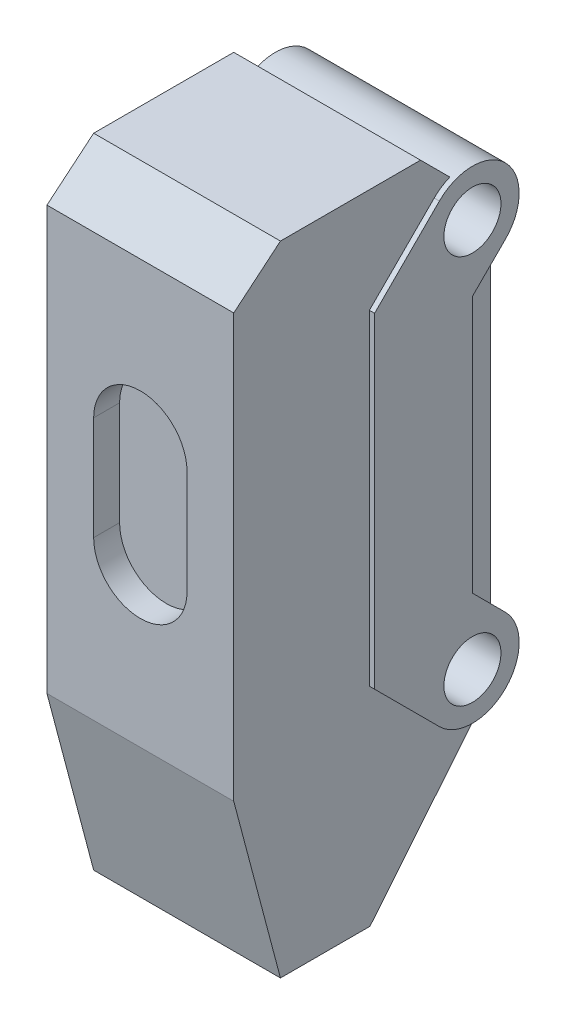
ISO-10303-21;
HEADER;
FILE_DESCRIPTION(('STEP AP214'),'2;1');
FILE_NAME('part.step','',(''),(''),'','','');
FILE_SCHEMA(('AUTOMOTIVE_DESIGN { 1 0 10303 214 1 1 1 1 }'));
ENDSEC;
DATA;
#1=APPLICATION_CONTEXT('core data for automotive mechanical design processes');
#2=APPLICATION_PROTOCOL_DEFINITION('international standard','automotive_design',2000,#1);
#3=PRODUCT_CONTEXT('',#1,'mechanical');
#4=PRODUCT('Part','Part','',(#3));
#5=PRODUCT_RELATED_PRODUCT_CATEGORY('part','',(#4));
#6=PRODUCT_DEFINITION_FORMATION('','',#4);
#7=PRODUCT_DEFINITION_CONTEXT('part definition',#1,'design');
#8=PRODUCT_DEFINITION('design','',#6,#7);
#9=PRODUCT_DEFINITION_SHAPE('','',#8);
#10=(LENGTH_UNIT() NAMED_UNIT(*) SI_UNIT(.MILLI.,.METRE.));
#11=(NAMED_UNIT(*) PLANE_ANGLE_UNIT() SI_UNIT($,.RADIAN.));
#12=(NAMED_UNIT(*) SI_UNIT($,.STERADIAN.) SOLID_ANGLE_UNIT());
#13=UNCERTAINTY_MEASURE_WITH_UNIT(LENGTH_MEASURE(1.E-05),#10,'distance_accuracy_value','');
#14=(GEOMETRIC_REPRESENTATION_CONTEXT(3) GLOBAL_UNCERTAINTY_ASSIGNED_CONTEXT((#13)) GLOBAL_UNIT_ASSIGNED_CONTEXT((#10,
#11,#12)) REPRESENTATION_CONTEXT('',''));
#15=CARTESIAN_POINT('',(0.,0.,0.));
#16=DIRECTION('',(0.,0.,1.));
#17=DIRECTION('',(1.,0.,0.));
#18=AXIS2_PLACEMENT_3D('',#15,#16,#17);
#19=CARTESIAN_POINT('',(8.69116882454314,8.7,0.));
#20=DIRECTION('',(0.,-0.707106781186548,0.707106781186547));
#21=DIRECTION('',(0.,-0.707106781186547,-0.707106781186548));
#22=AXIS2_PLACEMENT_3D('',#19,#20,#21);
#23=PLANE('',#22);
#24=DIRECTION('',(1.,0.,0.));
#25=VECTOR('',#24,1.);
#26=CARTESIAN_POINT('',(0.,11.170469991072,2.47046999107196));
#27=LINE('',#26,#25);
#28=CARTESIAN_POINT('',(3.6,11.170469991072,2.47046999107196));
#29=VERTEX_POINT('',#28);
#30=CARTESIAN_POINT('',(-3.6,11.170469991072,2.47046999107196));
#31=VERTEX_POINT('',#30);
#32=EDGE_CURVE('E445',#29,#31,#27,.F.);
#33=ORIENTED_EDGE('',*,*,#32,.T.);
#34=DIRECTION('',(0.,0.707106781186547,0.707106781186548));
#35=VECTOR('',#34,1.);
#36=CARTESIAN_POINT('',(-3.6,8.7,0.));
#37=LINE('',#36,#35);
#38=CARTESIAN_POINT('',(-3.6,12.3,3.6));
#39=VERTEX_POINT('',#38);
#40=EDGE_CURVE('E506',#31,#39,#37,.T.);
#41=ORIENTED_EDGE('',*,*,#40,.T.);
#42=DIRECTION('',(-1.,0.,0.));
#43=VECTOR('',#42,1.);
#44=CARTESIAN_POINT('',(8.69116882454314,12.3,3.6));
#45=LINE('',#44,#43);
#46=CARTESIAN_POINT('',(3.6,12.3,3.6));
#47=VERTEX_POINT('',#46);
#48=EDGE_CURVE('E512',#47,#39,#45,.T.);
#49=ORIENTED_EDGE('',*,*,#48,.F.);
#50=DIRECTION('',(0.,-0.707106781186547,-0.707106781186548));
#51=VECTOR('',#50,1.);
#52=CARTESIAN_POINT('',(3.6,8.7,0.));
#53=LINE('',#52,#51);
#54=EDGE_CURVE('E507',#47,#29,#53,.T.);
#55=ORIENTED_EDGE('',*,*,#54,.T.);
#56=EDGE_LOOP('',(#33,#41,#49,#55));
#57=FACE_BOUND('',#56,.T.);
#58=ADVANCED_FACE('F46',(#57),#23,.F.);
#59=CARTESIAN_POINT('',(-3.6,12.3,10.8));
#60=DIRECTION('',(1.,0.,0.));
#61=DIRECTION('',(0.,1.,0.));
#62=AXIS2_PLACEMENT_3D('',#59,#60,#61);
#63=PLANE('',#62);
#64=CARTESIAN_POINT('',(-3.6,-5.5,1.8));
#65=DIRECTION('',(1.,0.,0.));
#66=DIRECTION('',(0.,1.,0.));
#67=AXIS2_PLACEMENT_3D('',#64,#65,#66);
#68=CIRCLE('',#67,1.8);
#69=CARTESIAN_POINT('',(-3.6,-5.39428065447785,0.00310728757046941));
#70=VERTEX_POINT('',#69);
#71=CARTESIAN_POINT('',(-3.6,-5.50000000000001,0.));
#72=VERTEX_POINT('',#71);
#73=EDGE_CURVE('E361',#70,#72,#68,.F.);
#74=ORIENTED_EDGE('',*,*,#73,.F.);
#75=DIRECTION('',(0.,0.,-1.));
#76=VECTOR('',#75,1.);
#77=CARTESIAN_POINT('',(-3.6,-5.39428065447785,10.8));
#78=LINE('',#77,#76);
#79=CARTESIAN_POINT('',(-3.6,-5.39428065447785,0.));
#80=VERTEX_POINT('',#79);
#81=EDGE_CURVE('E492',#70,#80,#78,.T.);
#82=ORIENTED_EDGE('',*,*,#81,.T.);
#83=DIRECTION('',(0.,-1.,0.));
#84=VECTOR('',#83,1.);
#85=CARTESIAN_POINT('',(-3.6,12.3,0.));
#86=LINE('',#85,#84);
#87=EDGE_CURVE('E523',#80,#72,#86,.T.);
#88=ORIENTED_EDGE('',*,*,#87,.T.);
#89=EDGE_LOOP('',(#74,#82,#88));
#90=FACE_BOUND('',#89,.T.);
#91=ADVANCED_FACE('F645',(#90),#63,.F.);
#92=CARTESIAN_POINT('',(-3.6,9.5,1.8));
#93=DIRECTION('',(1.,0.,0.));
#94=DIRECTION('',(0.,1.,0.));
#95=AXIS2_PLACEMENT_3D('',#92,#93,#94);
#96=CIRCLE('',#95,1.8);
#97=CARTESIAN_POINT('',(-3.6,10.7727922061358,3.07279220613579));
#98=VERTEX_POINT('',#97);
#99=EDGE_CURVE('E365',#98,#31,#96,.F.);
#100=ORIENTED_EDGE('',*,*,#99,.F.);
#101=DIRECTION('',(0.,0.707106781186546,-0.707106781186549));
#102=VECTOR('',#101,1.);
#103=CARTESIAN_POINT('',(-3.6,7.67279220613578,6.1727922061358));
#104=LINE('',#103,#102);
#105=CARTESIAN_POINT('',(-3.6,8.27450532965404,5.57107908261755));
#106=VERTEX_POINT('',#105);
#107=EDGE_CURVE('E11',#106,#98,#104,.T.);
#108=ORIENTED_EDGE('',*,*,#107,.F.);
#109=DIRECTION('',(0.,1.,0.));
#110=VECTOR('',#109,1.);
#111=CARTESIAN_POINT('',(-3.6,12.3,5.57107908261755));
#112=LINE('',#111,#110);
#113=CARTESIAN_POINT('',(-3.6,-4.27450532965404,5.57107908261755));
#114=VERTEX_POINT('',#113);
#115=EDGE_CURVE('E55',#114,#106,#112,.T.);
#116=ORIENTED_EDGE('',*,*,#115,.F.);
#117=DIRECTION('',(0.,0.707106781186546,0.707106781186549));
#118=VECTOR('',#117,1.);
#119=CARTESIAN_POINT('',(-3.6,6.62720779386416,16.4727922061358));
#120=LINE('',#119,#118);
#121=CARTESIAN_POINT('',(-3.6,-6.77279220613579,3.07279220613578));
#122=VERTEX_POINT('',#121);
#123=EDGE_CURVE('E579',#122,#114,#120,.T.);
#124=ORIENTED_EDGE('',*,*,#123,.F.);
#125=CARTESIAN_POINT('',(-3.6,-7.26349417529286,1.43932245189343));
#126=VERTEX_POINT('',#125);
#127=EDGE_CURVE('E344',#126,#122,#68,.F.);
#128=ORIENTED_EDGE('',*,*,#127,.F.);
#129=DIRECTION('',(0.,-0.774718147333196,0.632306723191064));
#130=VECTOR('',#129,1.);
#131=CARTESIAN_POINT('',(-3.6,-0.107132426907233,-4.40153162215661));
#132=LINE('',#131,#130);
#133=CARTESIAN_POINT('',(-3.6,-12.3,5.55));
#134=VERTEX_POINT('',#133);
#135=EDGE_CURVE('E495',#126,#134,#132,.T.);
#136=ORIENTED_EDGE('',*,*,#135,.T.);
#137=DIRECTION('',(0.,0.,-1.));
#138=VECTOR('',#137,1.);
#139=CARTESIAN_POINT('',(-3.6,-12.3,10.8));
#140=LINE('',#139,#138);
#141=CARTESIAN_POINT('',(-3.6,-12.3,9.));
#142=VERTEX_POINT('',#141);
#143=EDGE_CURVE('E537',#142,#134,#140,.T.);
#144=ORIENTED_EDGE('',*,*,#143,.F.);
#145=DIRECTION('',(0.,0.966705227861512,0.255892560316282));
#146=VECTOR('',#145,1.);
#147=CARTESIAN_POINT('',(-3.6,11.134438156831,15.2032336297494));
#148=LINE('',#147,#146);
#149=CARTESIAN_POINT('',(-3.6,-5.5,10.8));
#150=VERTEX_POINT('',#149);
#151=EDGE_CURVE('E498',#142,#150,#148,.T.);
#152=ORIENTED_EDGE('',*,*,#151,.T.);
#153=DIRECTION('',(0.,-1.,0.));
#154=VECTOR('',#153,1.);
#155=CARTESIAN_POINT('',(-3.6,12.3,10.8));
#156=LINE('',#155,#154);
#157=CARTESIAN_POINT('',(-3.6,10.8,10.8));
#158=VERTEX_POINT('',#157);
#159=EDGE_CURVE('E522',#158,#150,#156,.T.);
#160=ORIENTED_EDGE('',*,*,#159,.F.);
#161=DIRECTION('',(0.,0.64018439966448,-0.768221279597376));
#162=VECTOR('',#161,1.);
#163=CARTESIAN_POINT('',(-3.6,11.4147540983607,10.0622950819672));
#164=LINE('',#163,#162);
#165=CARTESIAN_POINT('',(-3.6,12.3,9.));
#166=VERTEX_POINT('',#165);
#167=EDGE_CURVE('E502',#158,#166,#164,.T.);
#168=ORIENTED_EDGE('',*,*,#167,.T.);
#169=DIRECTION('',(0.,0.,-1.));
#170=VECTOR('',#169,1.);
#171=CARTESIAN_POINT('',(-3.6,12.3,10.8));
#172=LINE('',#171,#170);
#173=EDGE_CURVE('E541',#166,#39,#172,.T.);
#174=ORIENTED_EDGE('',*,*,#173,.T.);
#175=ORIENTED_EDGE('',*,*,#40,.F.);
#176=EDGE_LOOP('',(#100,#108,#116,#124,#128,#136,#144,#152,#160,#168,#174,#175));
#177=FACE_BOUND('',#176,.T.);
#178=ADVANCED_FACE('F596',(#177),#63,.F.);
#179=DIRECTION('',(0.,-0.707106781186546,-0.707106781186549));
#180=VECTOR('',#179,1.);
#181=CARTESIAN_POINT('',(-3.6,9.17279220613576,13.9272077938642));
#182=LINE('',#181,#180);
#183=CARTESIAN_POINT('',(-3.6,-2.95441558772843,1.8));
#184=VERTEX_POINT('',#183);
#185=CARTESIAN_POINT('',(-3.6,-3.85441558772843,0.9));
#186=VERTEX_POINT('',#185);
#187=EDGE_CURVE('E369',#184,#186,#182,.T.);
#188=ORIENTED_EDGE('',*,*,#187,.F.);
#189=DIRECTION('',(0.,-1.,0.));
#190=VECTOR('',#189,1.);
#191=CARTESIAN_POINT('',(-3.6,12.3,1.8));
#192=LINE('',#191,#190);
#193=CARTESIAN_POINT('',(-3.6,6.95441558772843,1.8));
#194=VERTEX_POINT('',#193);
#195=EDGE_CURVE('E576',#194,#184,#192,.T.);
#196=ORIENTED_EDGE('',*,*,#195,.F.);
#197=DIRECTION('',(0.,-0.707106781186546,0.707106781186549));
#198=VECTOR('',#197,1.);
#199=CARTESIAN_POINT('',(-3.6,5.1272077938642,3.62720779386424));
#200=LINE('',#199,#198);
#201=CARTESIAN_POINT('',(-3.6,7.85441558772843,0.9));
#202=VERTEX_POINT('',#201);
#203=EDGE_CURVE('E362',#202,#194,#200,.T.);
#204=ORIENTED_EDGE('',*,*,#203,.F.);
#205=DIRECTION('',(0.,-1.,0.));
#206=VECTOR('',#205,1.);
#207=CARTESIAN_POINT('',(-3.6,12.3,0.900000000000001));
#208=LINE('',#207,#206);
#209=EDGE_CURVE('E557',#202,#186,#208,.T.);
#210=ORIENTED_EDGE('',*,*,#209,.T.);
#211=EDGE_LOOP('',(#188,#196,#204,#210));
#212=FACE_BOUND('',#211,.T.);
#213=ADVANCED_FACE('F652',(#212),#63,.F.);
#214=CARTESIAN_POINT('',(-7.2,-5.39428065447786,0.129530008928037));
#215=DIRECTION('',(0.,-1.,0.));
#216=DIRECTION('',(1.,0.,0.));
#217=AXIS2_PLACEMENT_3D('',#214,#215,#216);
#218=PLANE('',#217);
#219=ORIENTED_EDGE('',*,*,#81,.F.);
#220=DIRECTION('',(1.,0.,0.));
#221=VECTOR('',#220,1.);
#222=CARTESIAN_POINT('',(0.,-5.39428065447785,0.00310728757046941));
#223=LINE('',#222,#221);
#224=CARTESIAN_POINT('',(3.6,-5.39428065447785,0.00310728757046941));
#225=VERTEX_POINT('',#224);
#226=EDGE_CURVE('E439',#70,#225,#223,.T.);
#227=ORIENTED_EDGE('',*,*,#226,.T.);
#228=DIRECTION('',(0.,0.,-1.));
#229=VECTOR('',#228,1.);
#230=CARTESIAN_POINT('',(3.6,-5.39428065447785,0.129530008928037));
#231=LINE('',#230,#229);
#232=CARTESIAN_POINT('',(3.6,-5.39428065447785,0.));
#233=VERTEX_POINT('',#232);
#234=EDGE_CURVE('E468',#225,#233,#231,.T.);
#235=ORIENTED_EDGE('',*,*,#234,.T.);
#236=DIRECTION('',(1.,0.,0.));
#237=VECTOR('',#236,1.);
#238=CARTESIAN_POINT('',(-7.2,-5.39428065447786,0.));
#239=LINE('',#238,#237);
#240=EDGE_CURVE('E472',#80,#233,#239,.T.);
#241=ORIENTED_EDGE('',*,*,#240,.F.);
#242=EDGE_LOOP('',(#219,#227,#235,#241));
#243=FACE_BOUND('',#242,.T.);
#244=ADVANCED_FACE('F680',(#243),#218,.F.);
#245=CARTESIAN_POINT('',(-7.2,-12.3,5.55));
#246=DIRECTION('',(0.,0.632306723191064,0.774718147333196));
#247=DIRECTION('',(0.,-0.774718147333196,0.632306723191064));
#248=AXIS2_PLACEMENT_3D('',#245,#246,#247);
#249=PLANE('',#248);
#250=ORIENTED_EDGE('',*,*,#135,.F.);
#251=DIRECTION('',(1.,0.,0.));
#252=VECTOR('',#251,1.);
#253=CARTESIAN_POINT('',(0.,-7.26349417529286,1.43932245189343));
#254=LINE('',#253,#252);
#255=CARTESIAN_POINT('',(3.6,-7.26349417529286,1.43932245189343));
#256=VERTEX_POINT('',#255);
#257=EDGE_CURVE('E561',#126,#256,#254,.T.);
#258=ORIENTED_EDGE('',*,*,#257,.T.);
#259=DIRECTION('',(0.,-0.774718147333196,0.632306723191064));
#260=VECTOR('',#259,1.);
#261=CARTESIAN_POINT('',(3.6,-12.3,5.55));
#262=LINE('',#261,#260);
#263=CARTESIAN_POINT('',(3.6,-12.3,5.55));
#264=VERTEX_POINT('',#263);
#265=EDGE_CURVE('E476',#256,#264,#262,.T.);
#266=ORIENTED_EDGE('',*,*,#265,.T.);
#267=DIRECTION('',(1.,0.,0.));
#268=VECTOR('',#267,1.);
#269=CARTESIAN_POINT('',(-7.2,-12.3,5.55));
#270=LINE('',#269,#268);
#271=EDGE_CURVE('E455',#134,#264,#270,.T.);
#272=ORIENTED_EDGE('',*,*,#271,.F.);
#273=EDGE_LOOP('',(#250,#258,#266,#272));
#274=FACE_BOUND('',#273,.T.);
#275=ADVANCED_FACE('F619',(#274),#249,.F.);
#276=CARTESIAN_POINT('',(3.6,12.3,10.8));
#277=DIRECTION('',(-1.,0.,0.));
#278=DIRECTION('',(0.,-1.,0.));
#279=AXIS2_PLACEMENT_3D('',#276,#277,#278);
#280=PLANE('',#279);
#281=DIRECTION('',(0.,-1.,0.));
#282=VECTOR('',#281,1.);
#283=CARTESIAN_POINT('',(3.6,7.85441558772843,0.9));
#284=LINE('',#283,#282);
#285=CARTESIAN_POINT('',(3.6,7.85441558772843,0.9));
#286=VERTEX_POINT('',#285);
#287=CARTESIAN_POINT('',(3.6,-3.85441558772843,0.9));
#288=VERTEX_POINT('',#287);
#289=EDGE_CURVE('E461',#286,#288,#284,.T.);
#290=ORIENTED_EDGE('',*,*,#289,.F.);
#291=DIRECTION('',(0.,-0.707106781186546,0.707106781186549));
#292=VECTOR('',#291,1.);
#293=CARTESIAN_POINT('',(3.6,5.1272077938642,3.62720779386424));
#294=LINE('',#293,#292);
#295=CARTESIAN_POINT('',(3.6,6.95441558772843,1.8));
#296=VERTEX_POINT('',#295);
#297=EDGE_CURVE('E70',#286,#296,#294,.T.);
#298=ORIENTED_EDGE('',*,*,#297,.T.);
#299=DIRECTION('',(0.,-1.,0.));
#300=VECTOR('',#299,1.);
#301=CARTESIAN_POINT('',(3.6,12.3,1.8));
#302=LINE('',#301,#300);
#303=CARTESIAN_POINT('',(3.6,-2.95441558772843,1.8));
#304=VERTEX_POINT('',#303);
#305=EDGE_CURVE('E573',#296,#304,#302,.T.);
#306=ORIENTED_EDGE('',*,*,#305,.T.);
#307=DIRECTION('',(0.,-0.707106781186546,-0.707106781186549));
#308=VECTOR('',#307,1.);
#309=CARTESIAN_POINT('',(3.6,9.17279220613576,13.9272077938642));
#310=LINE('',#309,#308);
#311=EDGE_CURVE('E451',#304,#288,#310,.T.);
#312=ORIENTED_EDGE('',*,*,#311,.T.);
#313=EDGE_LOOP('',(#290,#298,#306,#312));
#314=FACE_BOUND('',#313,.T.);
#315=ADVANCED_FACE('F671',(#314),#280,.F.);
#316=ORIENTED_EDGE('',*,*,#234,.F.);
#317=CARTESIAN_POINT('',(3.6,-5.5,1.8));
#318=DIRECTION('',(-1.,0.,0.));
#319=DIRECTION('',(0.,-1.,0.));
#320=AXIS2_PLACEMENT_3D('',#317,#318,#319);
#321=CIRCLE('',#320,1.8);
#322=CARTESIAN_POINT('',(3.6,-5.5,0.));
#323=VERTEX_POINT('',#322);
#324=EDGE_CURVE('E416',#225,#323,#321,.T.);
#325=ORIENTED_EDGE('',*,*,#324,.T.);
#326=DIRECTION('',(0.,1.,0.));
#327=VECTOR('',#326,1.);
#328=CARTESIAN_POINT('',(3.6,12.3,0.));
#329=LINE('',#328,#327);
#330=EDGE_CURVE('E511',#323,#233,#329,.T.);
#331=ORIENTED_EDGE('',*,*,#330,.T.);
#332=EDGE_LOOP('',(#316,#325,#331));
#333=FACE_BOUND('',#332,.T.);
#334=ADVANCED_FACE('F670',(#333),#280,.F.);
#335=DIRECTION('',(0.,0.707106781186546,-0.707106781186549));
#336=VECTOR('',#335,1.);
#337=CARTESIAN_POINT('',(3.6,7.67279220613578,6.1727922061358));
#338=LINE('',#337,#336);
#339=CARTESIAN_POINT('',(3.6,8.27450532965404,5.57107908261755));
#340=VERTEX_POINT('',#339);
#341=CARTESIAN_POINT('',(3.6,10.7727922061358,3.07279220613579));
#342=VERTEX_POINT('',#341);
#343=EDGE_CURVE('E564',#340,#342,#338,.T.);
#344=ORIENTED_EDGE('',*,*,#343,.T.);
#345=CARTESIAN_POINT('',(3.6,9.5,1.8));
#346=DIRECTION('',(-1.,0.,0.));
#347=DIRECTION('',(0.,-1.,0.));
#348=AXIS2_PLACEMENT_3D('',#345,#346,#347);
#349=CIRCLE('',#348,1.8);
#350=EDGE_CURVE('E448',#342,#29,#349,.T.);
#351=ORIENTED_EDGE('',*,*,#350,.T.);
#352=ORIENTED_EDGE('',*,*,#54,.F.);
#353=DIRECTION('',(0.,0.,-1.));
#354=VECTOR('',#353,1.);
#355=CARTESIAN_POINT('',(3.6,12.3,10.8));
#356=LINE('',#355,#354);
#357=CARTESIAN_POINT('',(3.6,12.3,9.));
#358=VERTEX_POINT('',#357);
#359=EDGE_CURVE('E545',#358,#47,#356,.T.);
#360=ORIENTED_EDGE('',*,*,#359,.F.);
#361=DIRECTION('',(0.,0.64018439966448,-0.768221279597376));
#362=VECTOR('',#361,1.);
#363=CARTESIAN_POINT('',(3.6,10.8,10.8));
#364=LINE('',#363,#362);
#365=CARTESIAN_POINT('',(3.6,10.8,10.8));
#366=VERTEX_POINT('',#365);
#367=EDGE_CURVE('E460',#366,#358,#364,.T.);
#368=ORIENTED_EDGE('',*,*,#367,.F.);
#369=DIRECTION('',(0.,1.,0.));
#370=VECTOR('',#369,1.);
#371=CARTESIAN_POINT('',(3.6,12.3,10.8));
#372=LINE('',#371,#370);
#373=CARTESIAN_POINT('',(3.6,-5.5,10.8));
#374=VERTEX_POINT('',#373);
#375=EDGE_CURVE('E518',#374,#366,#372,.T.);
#376=ORIENTED_EDGE('',*,*,#375,.F.);
#377=DIRECTION('',(0.,0.966705227861512,0.255892560316282));
#378=VECTOR('',#377,1.);
#379=CARTESIAN_POINT('',(3.6,-5.5,10.8));
#380=LINE('',#379,#378);
#381=CARTESIAN_POINT('',(3.6,-12.3,9.));
#382=VERTEX_POINT('',#381);
#383=EDGE_CURVE('E464',#382,#374,#380,.T.);
#384=ORIENTED_EDGE('',*,*,#383,.F.);
#385=DIRECTION('',(0.,0.,-1.));
#386=VECTOR('',#385,1.);
#387=CARTESIAN_POINT('',(3.6,-12.3,10.8));
#388=LINE('',#387,#386);
#389=EDGE_CURVE('E527',#382,#264,#388,.T.);
#390=ORIENTED_EDGE('',*,*,#389,.T.);
#391=ORIENTED_EDGE('',*,*,#265,.F.);
#392=CARTESIAN_POINT('',(3.6,-6.77279220613579,3.07279220613578));
#393=VERTEX_POINT('',#392);
#394=EDGE_CURVE('E440',#256,#393,#321,.T.);
#395=ORIENTED_EDGE('',*,*,#394,.T.);
#396=DIRECTION('',(0.,0.707106781186546,0.707106781186549));
#397=VECTOR('',#396,1.);
#398=CARTESIAN_POINT('',(3.6,6.62720779386416,16.4727922061358));
#399=LINE('',#398,#397);
#400=CARTESIAN_POINT('',(3.6,-4.27450532965404,5.57107908261755));
#401=VERTEX_POINT('',#400);
#402=EDGE_CURVE('E570',#393,#401,#399,.T.);
#403=ORIENTED_EDGE('',*,*,#402,.T.);
#404=DIRECTION('',(0.,1.,0.));
#405=VECTOR('',#404,1.);
#406=CARTESIAN_POINT('',(3.6,12.3,5.57107908261755));
#407=LINE('',#406,#405);
#408=EDGE_CURVE('E567',#401,#340,#407,.T.);
#409=ORIENTED_EDGE('',*,*,#408,.T.);
#410=EDGE_LOOP('',(#344,#351,#352,#360,#368,#376,#384,#390,#391,#395,#403,#409));
#411=FACE_BOUND('',#410,.T.);
#412=ADVANCED_FACE('F48',(#411),#280,.F.);
#413=CARTESIAN_POINT('',(-3.6,12.3,10.8));
#414=DIRECTION('',(0.,-1.,0.));
#415=DIRECTION('',(0.,0.,-1.));
#416=AXIS2_PLACEMENT_3D('',#413,#414,#415);
#417=PLANE('',#416);
#418=ORIENTED_EDGE('',*,*,#173,.F.);
#419=DIRECTION('',(1.,0.,0.));
#420=VECTOR('',#419,1.);
#421=CARTESIAN_POINT('',(-7.2,12.3,9.));
#422=LINE('',#421,#420);
#423=EDGE_CURVE('E456',#166,#358,#422,.T.);
#424=ORIENTED_EDGE('',*,*,#423,.T.);
#425=ORIENTED_EDGE('',*,*,#359,.T.);
#426=ORIENTED_EDGE('',*,*,#48,.T.);
#427=EDGE_LOOP('',(#418,#424,#425,#426));
#428=FACE_BOUND('',#427,.T.);
#429=ADVANCED_FACE('F642',(#428),#417,.F.);
#430=CARTESIAN_POINT('',(-3.6,-12.3,10.8));
#431=DIRECTION('',(0.,1.,0.));
#432=DIRECTION('',(0.,0.,1.));
#433=AXIS2_PLACEMENT_3D('',#430,#431,#432);
#434=PLANE('',#433);
#435=ORIENTED_EDGE('',*,*,#143,.T.);
#436=ORIENTED_EDGE('',*,*,#271,.T.);
#437=ORIENTED_EDGE('',*,*,#389,.F.);
#438=DIRECTION('',(1.,0.,0.));
#439=VECTOR('',#438,1.);
#440=CARTESIAN_POINT('',(-7.2,-12.3,9.));
#441=LINE('',#440,#439);
#442=EDGE_CURVE('E489',#142,#382,#441,.T.);
#443=ORIENTED_EDGE('',*,*,#442,.F.);
#444=EDGE_LOOP('',(#435,#436,#437,#443));
#445=FACE_BOUND('',#444,.T.);
#446=ADVANCED_FACE('F624',(#445),#434,.F.);
#447=CARTESIAN_POINT('',(0.,0.,10.8));
#448=DIRECTION('',(0.,0.,1.));
#449=DIRECTION('',(1.,0.,0.));
#450=AXIS2_PLACEMENT_3D('',#447,#448,#449);
#451=PLANE('',#450);
#452=CARTESIAN_POINT('',(0.,4.6,10.8));
#453=DIRECTION('',(0.,0.,1.));
#454=DIRECTION('',(1.,0.,0.));
#455=AXIS2_PLACEMENT_3D('',#452,#453,#454);
#456=CIRCLE('',#455,1.8);
#457=CARTESIAN_POINT('',(1.8,4.6,10.8));
#458=VERTEX_POINT('',#457);
#459=CARTESIAN_POINT('',(-1.8,4.6,10.8));
#460=VERTEX_POINT('',#459);
#461=EDGE_CURVE('E62',#458,#460,#456,.T.);
#462=ORIENTED_EDGE('',*,*,#461,.F.);
#463=DIRECTION('',(0.,1.,0.));
#464=VECTOR('',#463,1.);
#465=CARTESIAN_POINT('',(1.8,4.6,10.8));
#466=LINE('',#465,#464);
#467=CARTESIAN_POINT('',(1.8,0.599999999999997,10.8));
#468=VERTEX_POINT('',#467);
#469=EDGE_CURVE('E273',#468,#458,#466,.T.);
#470=ORIENTED_EDGE('',*,*,#469,.F.);
#471=CARTESIAN_POINT('',(0.,0.599999999999996,10.8));
#472=DIRECTION('',(0.,0.,1.));
#473=DIRECTION('',(1.,0.,0.));
#474=AXIS2_PLACEMENT_3D('',#471,#472,#473);
#475=CIRCLE('',#474,1.8);
#476=CARTESIAN_POINT('',(-1.8,0.599999999999997,10.8));
#477=VERTEX_POINT('',#476);
#478=EDGE_CURVE('E277',#477,#468,#475,.T.);
#479=ORIENTED_EDGE('',*,*,#478,.F.);
#480=DIRECTION('',(0.,-1.,0.));
#481=VECTOR('',#480,1.);
#482=CARTESIAN_POINT('',(-1.8,4.6,10.8));
#483=LINE('',#482,#481);
#484=EDGE_CURVE('E286',#460,#477,#483,.T.);
#485=ORIENTED_EDGE('',*,*,#484,.F.);
#486=EDGE_LOOP('',(#462,#470,#479,#485));
#487=FACE_BOUND('',#486,.T.);
#488=DIRECTION('',(1.,0.,0.));
#489=VECTOR('',#488,1.);
#490=CARTESIAN_POINT('',(0.,10.8,10.8));
#491=LINE('',#490,#489);
#492=EDGE_CURVE('E554',#158,#366,#491,.T.);
#493=ORIENTED_EDGE('',*,*,#492,.F.);
#494=ORIENTED_EDGE('',*,*,#159,.T.);
#495=DIRECTION('',(-1.,0.,0.));
#496=VECTOR('',#495,1.);
#497=CARTESIAN_POINT('',(0.,-5.5,10.8));
#498=LINE('',#497,#496);
#499=EDGE_CURVE('E551',#374,#150,#498,.T.);
#500=ORIENTED_EDGE('',*,*,#499,.F.);
#501=ORIENTED_EDGE('',*,*,#375,.T.);
#502=EDGE_LOOP('',(#493,#494,#500,#501));
#503=FACE_BOUND('',#502,.T.);
#504=ADVANCED_FACE('F630',(#487,#503),#451,.T.);
#505=CARTESIAN_POINT('',(0.,0.,0.));
#506=DIRECTION('',(0.,0.,1.));
#507=DIRECTION('',(1.,0.,0.));
#508=AXIS2_PLACEMENT_3D('',#505,#506,#507);
#509=PLANE('',#508);
#510=ORIENTED_EDGE('',*,*,#330,.F.);
#511=DIRECTION('',(-1.,0.,0.));
#512=VECTOR('',#511,1.);
#513=CARTESIAN_POINT('',(0.,-5.5,0.));
#514=LINE('',#513,#512);
#515=EDGE_CURVE('E548',#323,#72,#514,.T.);
#516=ORIENTED_EDGE('',*,*,#515,.T.);
#517=ORIENTED_EDGE('',*,*,#87,.F.);
#518=ORIENTED_EDGE('',*,*,#240,.T.);
#519=EDGE_LOOP('',(#510,#516,#517,#518));
#520=FACE_BOUND('',#519,.T.);
#521=ADVANCED_FACE('F659',(#520),#509,.F.);
#522=CARTESIAN_POINT('',(-7.2,7.85441558772843,0.9));
#523=DIRECTION('',(0.,0.,1.));
#524=DIRECTION('',(0.,-1.,0.));
#525=AXIS2_PLACEMENT_3D('',#522,#523,#524);
#526=PLANE('',#525);
#527=DIRECTION('',(1.,0.,0.));
#528=VECTOR('',#527,1.);
#529=CARTESIAN_POINT('',(-7.2,7.85441558772843,0.9));
#530=LINE('',#529,#528);
#531=EDGE_CURVE('E465',#202,#286,#530,.T.);
#532=ORIENTED_EDGE('',*,*,#531,.T.);
#533=ORIENTED_EDGE('',*,*,#289,.T.);
#534=DIRECTION('',(1.,0.,0.));
#535=VECTOR('',#534,1.);
#536=CARTESIAN_POINT('',(-7.2,-3.85441558772843,0.9));
#537=LINE('',#536,#535);
#538=EDGE_CURVE('E469',#186,#288,#537,.T.);
#539=ORIENTED_EDGE('',*,*,#538,.F.);
#540=ORIENTED_EDGE('',*,*,#209,.F.);
#541=EDGE_LOOP('',(#532,#533,#539,#540));
#542=FACE_BOUND('',#541,.T.);
#543=ADVANCED_FACE('F663',(#542),#526,.F.);
#544=CARTESIAN_POINT('',(-7.2,-5.5,10.8));
#545=DIRECTION('',(0.,0.255892560316282,-0.966705227861512));
#546=DIRECTION('',(0.,0.966705227861512,0.255892560316283));
#547=AXIS2_PLACEMENT_3D('',#544,#545,#546);
#548=PLANE('',#547);
#549=ORIENTED_EDGE('',*,*,#442,.T.);
#550=ORIENTED_EDGE('',*,*,#383,.T.);
#551=ORIENTED_EDGE('',*,*,#499,.T.);
#552=ORIENTED_EDGE('',*,*,#151,.F.);
#553=EDGE_LOOP('',(#549,#550,#551,#552));
#554=FACE_BOUND('',#553,.T.);
#555=ADVANCED_FACE('F655',(#554),#548,.F.);
#556=CARTESIAN_POINT('',(-7.2,10.8,10.8));
#557=DIRECTION('',(0.,-0.768221279597376,-0.64018439966448));
#558=DIRECTION('',(0.,0.64018439966448,-0.768221279597376));
#559=AXIS2_PLACEMENT_3D('',#556,#557,#558);
#560=PLANE('',#559);
#561=ORIENTED_EDGE('',*,*,#492,.T.);
#562=ORIENTED_EDGE('',*,*,#367,.T.);
#563=ORIENTED_EDGE('',*,*,#423,.F.);
#564=ORIENTED_EDGE('',*,*,#167,.F.);
#565=EDGE_LOOP('',(#561,#562,#563,#564));
#566=FACE_BOUND('',#565,.T.);
#567=ADVANCED_FACE('F634',(#566),#560,.F.);
#568=CARTESIAN_POINT('',(0.,-2.95441558772843,1.8));
#569=DIRECTION('',(0.,0.,-1.));
#570=DIRECTION('',(-1.,0.,0.));
#571=AXIS2_PLACEMENT_3D('',#568,#569,#570);
#572=PLANE('',#571);
#573=ORIENTED_EDGE('',*,*,#305,.F.);
#574=DIRECTION('',(1.,0.,0.));
#575=VECTOR('',#574,1.);
#576=CARTESIAN_POINT('',(0.,6.95441558772843,1.8));
#577=LINE('',#576,#575);
#578=CARTESIAN_POINT('',(3.8,6.95441558772843,1.8));
#579=VERTEX_POINT('',#578);
#580=EDGE_CURVE('E417',#296,#579,#577,.T.);
#581=ORIENTED_EDGE('',*,*,#580,.T.);
#582=DIRECTION('',(0.,1.,0.));
#583=VECTOR('',#582,1.);
#584=CARTESIAN_POINT('',(3.8,-2.95441558772843,1.8));
#585=LINE('',#584,#583);
#586=CARTESIAN_POINT('',(3.8,-2.95441558772843,1.8));
#587=VERTEX_POINT('',#586);
#588=EDGE_CURVE('E404',#587,#579,#585,.T.);
#589=ORIENTED_EDGE('',*,*,#588,.F.);
#590=DIRECTION('',(1.,0.,0.));
#591=VECTOR('',#590,1.);
#592=CARTESIAN_POINT('',(0.,-2.95441558772843,1.8));
#593=LINE('',#592,#591);
#594=EDGE_CURVE('E420',#304,#587,#593,.T.);
#595=ORIENTED_EDGE('',*,*,#594,.F.);
#596=EDGE_LOOP('',(#573,#581,#589,#595));
#597=FACE_BOUND('',#596,.T.);
#598=ADVANCED_FACE('F691',(#597),#572,.T.);
#599=CARTESIAN_POINT('',(0.,-4.27450532965404,5.57107908261755));
#600=DIRECTION('',(0.,-0.707106781186549,0.707106781186546));
#601=DIRECTION('',(0.,-0.707106781186546,-0.707106781186549));
#602=AXIS2_PLACEMENT_3D('',#599,#600,#601);
#603=PLANE('',#602);
#604=ORIENTED_EDGE('',*,*,#402,.F.);
#605=DIRECTION('',(1.,0.,0.));
#606=VECTOR('',#605,1.);
#607=CARTESIAN_POINT('',(0.,-6.77279220613579,3.07279220613578));
#608=LINE('',#607,#606);
#609=CARTESIAN_POINT('',(3.8,-6.77279220613579,3.07279220613578));
#610=VERTEX_POINT('',#609);
#611=EDGE_CURVE('E426',#393,#610,#608,.T.);
#612=ORIENTED_EDGE('',*,*,#611,.T.);
#613=DIRECTION('',(0.,-0.707106781186546,-0.707106781186549));
#614=VECTOR('',#613,1.);
#615=CARTESIAN_POINT('',(3.8,-4.27450532965404,5.57107908261755));
#616=LINE('',#615,#614);
#617=CARTESIAN_POINT('',(3.8,-4.27450532965404,5.57107908261755));
#618=VERTEX_POINT('',#617);
#619=EDGE_CURVE('E392',#618,#610,#616,.T.);
#620=ORIENTED_EDGE('',*,*,#619,.F.);
#621=DIRECTION('',(1.,0.,0.));
#622=VECTOR('',#621,1.);
#623=CARTESIAN_POINT('',(0.,-4.27450532965404,5.57107908261755));
#624=LINE('',#623,#622);
#625=EDGE_CURVE('E429',#401,#618,#624,.T.);
#626=ORIENTED_EDGE('',*,*,#625,.F.);
#627=EDGE_LOOP('',(#604,#612,#620,#626));
#628=FACE_BOUND('',#627,.T.);
#629=ADVANCED_FACE('F716',(#628),#603,.T.);
#630=CARTESIAN_POINT('',(0.,8.27450532965404,5.57107908261755));
#631=DIRECTION('',(0.,0.,1.));
#632=DIRECTION('',(1.,0.,0.));
#633=AXIS2_PLACEMENT_3D('',#630,#631,#632);
#634=PLANE('',#633);
#635=ORIENTED_EDGE('',*,*,#408,.F.);
#636=ORIENTED_EDGE('',*,*,#625,.T.);
#637=DIRECTION('',(0.,-1.,0.));
#638=VECTOR('',#637,1.);
#639=CARTESIAN_POINT('',(3.8,8.27450532965404,5.57107908261755));
#640=LINE('',#639,#638);
#641=CARTESIAN_POINT('',(3.8,8.27450532965404,5.57107908261755));
#642=VERTEX_POINT('',#641);
#643=EDGE_CURVE('E388',#642,#618,#640,.T.);
#644=ORIENTED_EDGE('',*,*,#643,.F.);
#645=DIRECTION('',(1.,0.,0.));
#646=VECTOR('',#645,1.);
#647=CARTESIAN_POINT('',(0.,8.27450532965404,5.57107908261755));
#648=LINE('',#647,#646);
#649=EDGE_CURVE('E432',#340,#642,#648,.T.);
#650=ORIENTED_EDGE('',*,*,#649,.F.);
#651=EDGE_LOOP('',(#635,#636,#644,#650));
#652=FACE_BOUND('',#651,.T.);
#653=ADVANCED_FACE('F723',(#652),#634,.T.);
#654=CARTESIAN_POINT('',(0.,10.7727922061358,3.07279220613579));
#655=DIRECTION('',(0.,0.707106781186549,0.707106781186546));
#656=DIRECTION('',(0.,-0.707106781186546,0.707106781186549));
#657=AXIS2_PLACEMENT_3D('',#654,#655,#656);
#658=PLANE('',#657);
#659=ORIENTED_EDGE('',*,*,#343,.F.);
#660=ORIENTED_EDGE('',*,*,#649,.T.);
#661=DIRECTION('',(0.,-0.707106781186546,0.707106781186549));
#662=VECTOR('',#661,1.);
#663=CARTESIAN_POINT('',(3.8,10.7727922061358,3.07279220613579));
#664=LINE('',#663,#662);
#665=CARTESIAN_POINT('',(3.8,10.7727922061358,3.07279220613579));
#666=VERTEX_POINT('',#665);
#667=EDGE_CURVE('E384',#666,#642,#664,.T.);
#668=ORIENTED_EDGE('',*,*,#667,.F.);
#669=DIRECTION('',(1.,0.,0.));
#670=VECTOR('',#669,1.);
#671=CARTESIAN_POINT('',(0.,10.7727922061358,3.07279220613579));
#672=LINE('',#671,#670);
#673=EDGE_CURVE('E412',#342,#666,#672,.T.);
#674=ORIENTED_EDGE('',*,*,#673,.F.);
#675=EDGE_LOOP('',(#659,#660,#668,#674));
#676=FACE_BOUND('',#675,.T.);
#677=ADVANCED_FACE('F727',(#676),#658,.T.);
#678=CARTESIAN_POINT('',(0.,-5.5,1.8));
#679=DIRECTION('',(1.,0.,0.));
#680=DIRECTION('',(0.,1.,0.));
#681=AXIS2_PLACEMENT_3D('',#678,#679,#680);
#682=CYLINDRICAL_SURFACE('',#681,1.1);
#683=CARTESIAN_POINT('',(3.8,-5.5,1.8));
#684=DIRECTION('',(1.,0.,0.));
#685=DIRECTION('',(0.,1.,0.));
#686=AXIS2_PLACEMENT_3D('',#683,#684,#685);
#687=CIRCLE('',#686,1.1);
#688=CARTESIAN_POINT('',(3.8,-4.4,1.8));
#689=VERTEX_POINT('',#688);
#690=EDGE_CURVE('E372',#689,#689,#687,.T.);
#691=ORIENTED_EDGE('',*,*,#690,.T.);
#692=EDGE_LOOP('',(#691));
#693=FACE_BOUND('',#692,.T.);
#694=CARTESIAN_POINT('',(-3.8,-5.5,1.8));
#695=DIRECTION('',(1.,0.,0.));
#696=DIRECTION('',(0.,1.,0.));
#697=AXIS2_PLACEMENT_3D('',#694,#695,#696);
#698=CIRCLE('',#697,1.1);
#699=CARTESIAN_POINT('',(-3.8,-4.4,1.8));
#700=VERTEX_POINT('',#699);
#701=EDGE_CURVE('E295',#700,#700,#698,.T.);
#702=ORIENTED_EDGE('',*,*,#701,.F.);
#703=EDGE_LOOP('',(#702));
#704=FACE_BOUND('',#703,.T.);
#705=ADVANCED_FACE('F729',(#693,#704),#682,.F.);
#706=CARTESIAN_POINT('',(0.,9.5,1.8));
#707=DIRECTION('',(1.,0.,0.));
#708=DIRECTION('',(0.,1.,0.));
#709=AXIS2_PLACEMENT_3D('',#706,#707,#708);
#710=CYLINDRICAL_SURFACE('',#709,1.1);
#711=CARTESIAN_POINT('',(3.8,9.5,1.8));
#712=DIRECTION('',(1.,0.,0.));
#713=DIRECTION('',(0.,1.,0.));
#714=AXIS2_PLACEMENT_3D('',#711,#712,#713);
#715=CIRCLE('',#714,1.1);
#716=CARTESIAN_POINT('',(3.8,10.6,1.8));
#717=VERTEX_POINT('',#716);
#718=EDGE_CURVE('E376',#717,#717,#715,.T.);
#719=ORIENTED_EDGE('',*,*,#718,.T.);
#720=EDGE_LOOP('',(#719));
#721=FACE_BOUND('',#720,.T.);
#722=CARTESIAN_POINT('',(-3.8,9.5,1.8));
#723=DIRECTION('',(1.,0.,0.));
#724=DIRECTION('',(0.,1.,0.));
#725=AXIS2_PLACEMENT_3D('',#722,#723,#724);
#726=CIRCLE('',#725,1.1);
#727=CARTESIAN_POINT('',(-3.8,10.6,1.8));
#728=VERTEX_POINT('',#727);
#729=EDGE_CURVE('E304',#728,#728,#726,.T.);
#730=ORIENTED_EDGE('',*,*,#729,.F.);
#731=EDGE_LOOP('',(#730));
#732=FACE_BOUND('',#731,.T.);
#733=ADVANCED_FACE('F735',(#721,#732),#710,.F.);
#734=CARTESIAN_POINT('',(0.,-4.22720779386421,0.527207793864217));
#735=DIRECTION('',(0.,0.707106781186549,-0.707106781186546));
#736=DIRECTION('',(0.,0.707106781186546,0.707106781186549));
#737=AXIS2_PLACEMENT_3D('',#734,#735,#736);
#738=PLANE('',#737);
#739=ORIENTED_EDGE('',*,*,#311,.F.);
#740=ORIENTED_EDGE('',*,*,#594,.T.);
#741=DIRECTION('',(0.,0.707106781186546,0.707106781186549));
#742=VECTOR('',#741,1.);
#743=CARTESIAN_POINT('',(3.8,-4.22720779386421,0.527207793864217));
#744=LINE('',#743,#742);
#745=CARTESIAN_POINT('',(3.8,-4.22720779386421,0.527207793864217));
#746=VERTEX_POINT('',#745);
#747=EDGE_CURVE('E400',#746,#587,#744,.T.);
#748=ORIENTED_EDGE('',*,*,#747,.F.);
#749=DIRECTION('',(1.,0.,0.));
#750=VECTOR('',#749,1.);
#751=CARTESIAN_POINT('',(0.,-4.22720779386421,0.527207793864217));
#752=LINE('',#751,#750);
#753=CARTESIAN_POINT('',(-3.8,-4.22720779386421,0.527207793864217));
#754=VERTEX_POINT('',#753);
#755=EDGE_CURVE('E423',#754,#746,#752,.T.);
#756=ORIENTED_EDGE('',*,*,#755,.F.);
#757=DIRECTION('',(0.,0.707106781186546,0.707106781186549));
#758=VECTOR('',#757,1.);
#759=CARTESIAN_POINT('',(-3.8,-4.22720779386421,0.527207793864217));
#760=LINE('',#759,#758);
#761=CARTESIAN_POINT('',(-3.8,-2.95441558772843,1.8));
#762=VERTEX_POINT('',#761);
#763=EDGE_CURVE('E320',#754,#762,#760,.T.);
#764=ORIENTED_EDGE('',*,*,#763,.T.);
#765=DIRECTION('',(-1.,0.,0.));
#766=VECTOR('',#765,1.);
#767=CARTESIAN_POINT('',(0.,-2.95441558772843,1.8));
#768=LINE('',#767,#766);
#769=EDGE_CURVE('E354',#184,#762,#768,.T.);
#770=ORIENTED_EDGE('',*,*,#769,.F.);
#771=ORIENTED_EDGE('',*,*,#187,.T.);
#772=ORIENTED_EDGE('',*,*,#538,.T.);
#773=EDGE_LOOP('',(#739,#740,#748,#756,#764,#770,#771,#772));
#774=FACE_BOUND('',#773,.T.);
#775=ADVANCED_FACE('F699',(#774),#738,.T.);
#776=CARTESIAN_POINT('',(0.,9.5,1.8));
#777=DIRECTION('',(1.,0.,0.));
#778=DIRECTION('',(0.,1.,0.));
#779=AXIS2_PLACEMENT_3D('',#776,#777,#778);
#780=CYLINDRICAL_SURFACE('',#779,1.8);
#781=ORIENTED_EDGE('',*,*,#99,.T.);
#782=ORIENTED_EDGE('',*,*,#32,.F.);
#783=ORIENTED_EDGE('',*,*,#350,.F.);
#784=ORIENTED_EDGE('',*,*,#673,.T.);
#785=CARTESIAN_POINT('',(3.8,9.5,1.8));
#786=DIRECTION('',(1.,0.,0.));
#787=DIRECTION('',(0.,1.,0.));
#788=AXIS2_PLACEMENT_3D('',#785,#786,#787);
#789=CIRCLE('',#788,1.8);
#790=CARTESIAN_POINT('',(3.8,8.22720779386421,0.527207793864218));
#791=VERTEX_POINT('',#790);
#792=EDGE_CURVE('E380',#791,#666,#789,.T.);
#793=ORIENTED_EDGE('',*,*,#792,.F.);
#794=DIRECTION('',(1.,0.,0.));
#795=VECTOR('',#794,1.);
#796=CARTESIAN_POINT('',(0.,8.22720779386421,0.527207793864218));
#797=LINE('',#796,#795);
#798=CARTESIAN_POINT('',(-3.8,8.22720779386421,0.527207793864218));
#799=VERTEX_POINT('',#798);
#800=EDGE_CURVE('E413',#799,#791,#797,.T.);
#801=ORIENTED_EDGE('',*,*,#800,.F.);
#802=CARTESIAN_POINT('',(-3.8,9.5,1.8));
#803=DIRECTION('',(1.,0.,0.));
#804=DIRECTION('',(0.,1.,0.));
#805=AXIS2_PLACEMENT_3D('',#802,#803,#804);
#806=CIRCLE('',#805,1.8);
#807=CARTESIAN_POINT('',(-3.8,10.7727922061358,3.07279220613579));
#808=VERTEX_POINT('',#807);
#809=EDGE_CURVE('E308',#799,#808,#806,.T.);
#810=ORIENTED_EDGE('',*,*,#809,.T.);
#811=DIRECTION('',(-1.,0.,0.));
#812=VECTOR('',#811,1.);
#813=CARTESIAN_POINT('',(0.,10.7727922061358,3.07279220613579));
#814=LINE('',#813,#812);
#815=EDGE_CURVE('E341',#98,#808,#814,.T.);
#816=ORIENTED_EDGE('',*,*,#815,.F.);
#817=EDGE_LOOP('',(#781,#782,#783,#784,#793,#801,#810,#816));
#818=FACE_BOUND('',#817,.T.);
#819=ADVANCED_FACE('F600',(#818),#780,.T.);
#820=CARTESIAN_POINT('',(0.,6.95441558772843,1.8));
#821=DIRECTION('',(0.,-0.707106781186549,-0.707106781186546));
#822=DIRECTION('',(0.,0.707106781186546,-0.707106781186549));
#823=AXIS2_PLACEMENT_3D('',#820,#821,#822);
#824=PLANE('',#823);
#825=ORIENTED_EDGE('',*,*,#297,.F.);
#826=ORIENTED_EDGE('',*,*,#531,.F.);
#827=ORIENTED_EDGE('',*,*,#203,.T.);
#828=DIRECTION('',(-1.,0.,0.));
#829=VECTOR('',#828,1.);
#830=CARTESIAN_POINT('',(0.,6.95441558772843,1.8));
#831=LINE('',#830,#829);
#832=CARTESIAN_POINT('',(-3.8,6.95441558772843,1.8));
#833=VERTEX_POINT('',#832);
#834=EDGE_CURVE('E340',#194,#833,#831,.T.);
#835=ORIENTED_EDGE('',*,*,#834,.T.);
#836=DIRECTION('',(0.,0.707106781186546,-0.707106781186549));
#837=VECTOR('',#836,1.);
#838=CARTESIAN_POINT('',(-3.8,6.95441558772843,1.8));
#839=LINE('',#838,#837);
#840=EDGE_CURVE('E312',#833,#799,#839,.T.);
#841=ORIENTED_EDGE('',*,*,#840,.T.);
#842=ORIENTED_EDGE('',*,*,#800,.T.);
#843=DIRECTION('',(0.,0.707106781186546,-0.707106781186549));
#844=VECTOR('',#843,1.);
#845=CARTESIAN_POINT('',(3.8,6.95441558772843,1.8));
#846=LINE('',#845,#844);
#847=EDGE_CURVE('E408',#579,#791,#846,.T.);
#848=ORIENTED_EDGE('',*,*,#847,.F.);
#849=ORIENTED_EDGE('',*,*,#580,.F.);
#850=EDGE_LOOP('',(#825,#826,#827,#835,#841,#842,#848,#849));
#851=FACE_BOUND('',#850,.T.);
#852=ADVANCED_FACE('F686',(#851),#824,.T.);
#853=CARTESIAN_POINT('',(0.,-5.5,1.8));
#854=DIRECTION('',(1.,0.,0.));
#855=DIRECTION('',(0.,1.,0.));
#856=AXIS2_PLACEMENT_3D('',#853,#854,#855);
#857=CYLINDRICAL_SURFACE('',#856,1.8);
#858=CARTESIAN_POINT('',(-3.8,-5.5,1.8));
#859=DIRECTION('',(1.,0.,0.));
#860=DIRECTION('',(0.,1.,0.));
#861=AXIS2_PLACEMENT_3D('',#858,#859,#860);
#862=CIRCLE('',#861,1.8);
#863=CARTESIAN_POINT('',(-3.8,-6.77279220613579,3.07279220613578));
#864=VERTEX_POINT('',#863);
#865=EDGE_CURVE('E324',#864,#754,#862,.T.);
#866=ORIENTED_EDGE('',*,*,#865,.T.);
#867=ORIENTED_EDGE('',*,*,#755,.T.);
#868=CARTESIAN_POINT('',(3.8,-5.5,1.8));
#869=DIRECTION('',(1.,0.,0.));
#870=DIRECTION('',(0.,1.,0.));
#871=AXIS2_PLACEMENT_3D('',#868,#869,#870);
#872=CIRCLE('',#871,1.8);
#873=EDGE_CURVE('E396',#610,#746,#872,.T.);
#874=ORIENTED_EDGE('',*,*,#873,.F.);
#875=ORIENTED_EDGE('',*,*,#611,.F.);
#876=ORIENTED_EDGE('',*,*,#394,.F.);
#877=ORIENTED_EDGE('',*,*,#257,.F.);
#878=ORIENTED_EDGE('',*,*,#127,.T.);
#879=DIRECTION('',(-1.,0.,0.));
#880=VECTOR('',#879,1.);
#881=CARTESIAN_POINT('',(0.,-6.77279220613579,3.07279220613578));
#882=LINE('',#881,#880);
#883=EDGE_CURVE('E351',#122,#864,#882,.T.);
#884=ORIENTED_EDGE('',*,*,#883,.T.);
#885=EDGE_LOOP('',(#866,#867,#874,#875,#876,#877,#878,#884));
#886=FACE_BOUND('',#885,.T.);
#887=ORIENTED_EDGE('',*,*,#226,.F.);
#888=ORIENTED_EDGE('',*,*,#73,.T.);
#889=ORIENTED_EDGE('',*,*,#515,.F.);
#890=ORIENTED_EDGE('',*,*,#324,.F.);
#891=EDGE_LOOP('',(#887,#888,#889,#890));
#892=FACE_BOUND('',#891,.T.);
#893=ADVANCED_FACE('F709',(#886,#892),#857,.T.);
#894=CARTESIAN_POINT('',(3.8,9.5,1.8));
#895=DIRECTION('',(1.,0.,0.));
#896=DIRECTION('',(0.,1.,0.));
#897=AXIS2_PLACEMENT_3D('',#894,#895,#896);
#898=PLANE('',#897);
#899=ORIENTED_EDGE('',*,*,#718,.F.);
#900=EDGE_LOOP('',(#899));
#901=FACE_BOUND('',#900,.T.);
#902=ORIENTED_EDGE('',*,*,#792,.T.);
#903=ORIENTED_EDGE('',*,*,#667,.T.);
#904=ORIENTED_EDGE('',*,*,#643,.T.);
#905=ORIENTED_EDGE('',*,*,#619,.T.);
#906=ORIENTED_EDGE('',*,*,#873,.T.);
#907=ORIENTED_EDGE('',*,*,#747,.T.);
#908=ORIENTED_EDGE('',*,*,#588,.T.);
#909=ORIENTED_EDGE('',*,*,#847,.T.);
#910=EDGE_LOOP('',(#902,#903,#904,#905,#906,#907,#908,#909));
#911=FACE_BOUND('',#910,.T.);
#912=ORIENTED_EDGE('',*,*,#690,.F.);
#913=EDGE_LOOP('',(#912));
#914=FACE_BOUND('',#913,.T.);
#915=ADVANCED_FACE('F694',(#901,#911,#914),#898,.T.);
#916=CARTESIAN_POINT('',(0.,10.7727922061358,3.07279220613579));
#917=DIRECTION('',(0.,-0.707106781186549,-0.707106781186546));
#918=DIRECTION('',(0.,0.707106781186546,-0.707106781186549));
#919=AXIS2_PLACEMENT_3D('',#916,#917,#918);
#920=PLANE('',#919);
#921=DIRECTION('',(-1.,0.,0.));
#922=VECTOR('',#921,1.);
#923=CARTESIAN_POINT('',(0.,8.27450532965404,5.57107908261755));
#924=LINE('',#923,#922);
#925=CARTESIAN_POINT('',(-3.8,8.27450532965404,5.57107908261755));
#926=VERTEX_POINT('',#925);
#927=EDGE_CURVE('E345',#106,#926,#924,.T.);
#928=ORIENTED_EDGE('',*,*,#927,.F.);
#929=ORIENTED_EDGE('',*,*,#107,.T.);
#930=ORIENTED_EDGE('',*,*,#815,.T.);
#931=DIRECTION('',(0.,-0.707106781186546,0.707106781186549));
#932=VECTOR('',#931,1.);
#933=CARTESIAN_POINT('',(-3.8,10.7727922061358,3.07279220613579));
#934=LINE('',#933,#932);
#935=EDGE_CURVE('E336',#808,#926,#934,.T.);
#936=ORIENTED_EDGE('',*,*,#935,.T.);
#937=EDGE_LOOP('',(#928,#929,#930,#936));
#938=FACE_BOUND('',#937,.T.);
#939=ADVANCED_FACE('F592',(#938),#920,.F.);
#940=CARTESIAN_POINT('',(0.,8.27450532965404,5.57107908261755));
#941=DIRECTION('',(0.,0.,-1.));
#942=DIRECTION('',(-1.,0.,0.));
#943=AXIS2_PLACEMENT_3D('',#940,#941,#942);
#944=PLANE('',#943);
#945=DIRECTION('',(-1.,0.,0.));
#946=VECTOR('',#945,1.);
#947=CARTESIAN_POINT('',(0.,-4.27450532965404,5.57107908261755));
#948=LINE('',#947,#946);
#949=CARTESIAN_POINT('',(-3.8,-4.27450532965404,5.57107908261755));
#950=VERTEX_POINT('',#949);
#951=EDGE_CURVE('E348',#114,#950,#948,.T.);
#952=ORIENTED_EDGE('',*,*,#951,.F.);
#953=ORIENTED_EDGE('',*,*,#115,.T.);
#954=ORIENTED_EDGE('',*,*,#927,.T.);
#955=DIRECTION('',(0.,-1.,0.));
#956=VECTOR('',#955,1.);
#957=CARTESIAN_POINT('',(-3.8,8.27450532965404,5.57107908261755));
#958=LINE('',#957,#956);
#959=EDGE_CURVE('E332',#926,#950,#958,.T.);
#960=ORIENTED_EDGE('',*,*,#959,.T.);
#961=EDGE_LOOP('',(#952,#953,#954,#960));
#962=FACE_BOUND('',#961,.T.);
#963=ADVANCED_FACE('F586',(#962),#944,.F.);
#964=CARTESIAN_POINT('',(0.,-4.27450532965404,5.57107908261755));
#965=DIRECTION('',(0.,0.707106781186549,-0.707106781186546));
#966=DIRECTION('',(0.,0.707106781186546,0.707106781186549));
#967=AXIS2_PLACEMENT_3D('',#964,#965,#966);
#968=PLANE('',#967);
#969=ORIENTED_EDGE('',*,*,#883,.F.);
#970=ORIENTED_EDGE('',*,*,#123,.T.);
#971=ORIENTED_EDGE('',*,*,#951,.T.);
#972=DIRECTION('',(0.,-0.707106781186546,-0.707106781186549));
#973=VECTOR('',#972,1.);
#974=CARTESIAN_POINT('',(-3.8,-4.27450532965404,5.57107908261755));
#975=LINE('',#974,#973);
#976=EDGE_CURVE('E328',#950,#864,#975,.T.);
#977=ORIENTED_EDGE('',*,*,#976,.T.);
#978=EDGE_LOOP('',(#969,#970,#971,#977));
#979=FACE_BOUND('',#978,.T.);
#980=ADVANCED_FACE('F612',(#979),#968,.F.);
#981=CARTESIAN_POINT('',(0.,-2.95441558772843,1.8));
#982=DIRECTION('',(0.,0.,1.));
#983=DIRECTION('',(1.,0.,0.));
#984=AXIS2_PLACEMENT_3D('',#981,#982,#983);
#985=PLANE('',#984);
#986=ORIENTED_EDGE('',*,*,#834,.F.);
#987=ORIENTED_EDGE('',*,*,#195,.T.);
#988=ORIENTED_EDGE('',*,*,#769,.T.);
#989=DIRECTION('',(0.,1.,0.));
#990=VECTOR('',#989,1.);
#991=CARTESIAN_POINT('',(-3.8,-2.95441558772843,1.8));
#992=LINE('',#991,#990);
#993=EDGE_CURVE('E316',#762,#833,#992,.T.);
#994=ORIENTED_EDGE('',*,*,#993,.T.);
#995=EDGE_LOOP('',(#986,#987,#988,#994));
#996=FACE_BOUND('',#995,.T.);
#997=ADVANCED_FACE('F707',(#996),#985,.F.);
#998=CARTESIAN_POINT('',(-3.8,9.5,1.8));
#999=DIRECTION('',(-1.,0.,0.));
#1000=DIRECTION('',(0.,1.,0.));
#1001=AXIS2_PLACEMENT_3D('',#998,#999,#1000);
#1002=PLANE('',#1001);
#1003=ORIENTED_EDGE('',*,*,#701,.T.);
#1004=EDGE_LOOP('',(#1003));
#1005=FACE_BOUND('',#1004,.T.);
#1006=ORIENTED_EDGE('',*,*,#729,.T.);
#1007=EDGE_LOOP('',(#1006));
#1008=FACE_BOUND('',#1007,.T.);
#1009=ORIENTED_EDGE('',*,*,#809,.F.);
#1010=ORIENTED_EDGE('',*,*,#840,.F.);
#1011=ORIENTED_EDGE('',*,*,#993,.F.);
#1012=ORIENTED_EDGE('',*,*,#763,.F.);
#1013=ORIENTED_EDGE('',*,*,#865,.F.);
#1014=ORIENTED_EDGE('',*,*,#976,.F.);
#1015=ORIENTED_EDGE('',*,*,#959,.F.);
#1016=ORIENTED_EDGE('',*,*,#935,.F.);
#1017=EDGE_LOOP('',(#1009,#1010,#1011,#1012,#1013,#1014,#1015,#1016));
#1018=FACE_BOUND('',#1017,.T.);
#1019=ADVANCED_FACE('F606',(#1005,#1008,#1018),#1002,.T.);
#1020=CARTESIAN_POINT('',(0.,4.6,9.8));
#1021=DIRECTION('',(0.,0.,1.));
#1022=DIRECTION('',(1.,0.,0.));
#1023=AXIS2_PLACEMENT_3D('',#1020,#1021,#1022);
#1024=CYLINDRICAL_SURFACE('',#1023,1.8);
#1025=ORIENTED_EDGE('',*,*,#461,.T.);
#1026=DIRECTION('',(0.,0.,1.));
#1027=VECTOR('',#1026,1.);
#1028=CARTESIAN_POINT('',(-1.8,4.6,9.8));
#1029=LINE('',#1028,#1027);
#1030=CARTESIAN_POINT('',(-1.8,4.6,9.8));
#1031=VERTEX_POINT('',#1030);
#1032=EDGE_CURVE('E248',#1031,#460,#1029,.T.);
#1033=ORIENTED_EDGE('',*,*,#1032,.F.);
#1034=CARTESIAN_POINT('',(0.,4.6,9.8));
#1035=DIRECTION('',(0.,0.,1.));
#1036=DIRECTION('',(1.,0.,0.));
#1037=AXIS2_PLACEMENT_3D('',#1034,#1035,#1036);
#1038=CIRCLE('',#1037,1.8);
#1039=CARTESIAN_POINT('',(1.8,4.6,9.8));
#1040=VERTEX_POINT('',#1039);
#1041=EDGE_CURVE('E252',#1040,#1031,#1038,.T.);
#1042=ORIENTED_EDGE('',*,*,#1041,.F.);
#1043=DIRECTION('',(0.,0.,1.));
#1044=VECTOR('',#1043,1.);
#1045=CARTESIAN_POINT('',(1.8,4.6,9.8));
#1046=LINE('',#1045,#1044);
#1047=EDGE_CURVE('E292',#1040,#458,#1046,.T.);
#1048=ORIENTED_EDGE('',*,*,#1047,.T.);
#1049=EDGE_LOOP('',(#1025,#1033,#1042,#1048));
#1050=FACE_BOUND('',#1049,.T.);
#1051=ADVANCED_FACE('F250',(#1050),#1024,.F.);
#1052=CARTESIAN_POINT('',(1.8,4.6,9.8));
#1053=DIRECTION('',(1.,0.,0.));
#1054=DIRECTION('',(0.,1.,0.));
#1055=AXIS2_PLACEMENT_3D('',#1052,#1053,#1054);
#1056=PLANE('',#1055);
#1057=ORIENTED_EDGE('',*,*,#469,.T.);
#1058=ORIENTED_EDGE('',*,*,#1047,.F.);
#1059=DIRECTION('',(0.,1.,0.));
#1060=VECTOR('',#1059,1.);
#1061=CARTESIAN_POINT('',(1.8,4.6,9.8));
#1062=LINE('',#1061,#1060);
#1063=CARTESIAN_POINT('',(1.8,0.599999999999997,9.8));
#1064=VERTEX_POINT('',#1063);
#1065=EDGE_CURVE('E259',#1064,#1040,#1062,.T.);
#1066=ORIENTED_EDGE('',*,*,#1065,.F.);
#1067=DIRECTION('',(0.,0.,1.));
#1068=VECTOR('',#1067,1.);
#1069=CARTESIAN_POINT('',(1.8,0.599999999999997,9.8));
#1070=LINE('',#1069,#1068);
#1071=EDGE_CURVE('E296',#1064,#468,#1070,.T.);
#1072=ORIENTED_EDGE('',*,*,#1071,.T.);
#1073=EDGE_LOOP('',(#1057,#1058,#1066,#1072));
#1074=FACE_BOUND('',#1073,.T.);
#1075=ADVANCED_FACE('F962',(#1074),#1056,.F.);
#1076=CARTESIAN_POINT('',(0.,0.599999999999996,9.8));
#1077=DIRECTION('',(0.,0.,1.));
#1078=DIRECTION('',(1.,0.,0.));
#1079=AXIS2_PLACEMENT_3D('',#1076,#1077,#1078);
#1080=CYLINDRICAL_SURFACE('',#1079,1.8);
#1081=ORIENTED_EDGE('',*,*,#478,.T.);
#1082=ORIENTED_EDGE('',*,*,#1071,.F.);
#1083=CARTESIAN_POINT('',(0.,0.599999999999996,9.8));
#1084=DIRECTION('',(0.,0.,1.));
#1085=DIRECTION('',(1.,0.,0.));
#1086=AXIS2_PLACEMENT_3D('',#1083,#1084,#1085);
#1087=CIRCLE('',#1086,1.8);
#1088=CARTESIAN_POINT('',(-1.8,0.599999999999997,9.8));
#1089=VERTEX_POINT('',#1088);
#1090=EDGE_CURVE('E268',#1089,#1064,#1087,.T.);
#1091=ORIENTED_EDGE('',*,*,#1090,.F.);
#1092=DIRECTION('',(0.,0.,1.));
#1093=VECTOR('',#1092,1.);
#1094=CARTESIAN_POINT('',(-1.8,0.599999999999997,9.8));
#1095=LINE('',#1094,#1093);
#1096=EDGE_CURVE('E258',#1089,#477,#1095,.T.);
#1097=ORIENTED_EDGE('',*,*,#1096,.T.);
#1098=EDGE_LOOP('',(#1081,#1082,#1091,#1097));
#1099=FACE_BOUND('',#1098,.T.);
#1100=ADVANCED_FACE('F972',(#1099),#1080,.F.);
#1101=CARTESIAN_POINT('',(-1.8,4.6,9.8));
#1102=DIRECTION('',(-1.,0.,0.));
#1103=DIRECTION('',(0.,-1.,0.));
#1104=AXIS2_PLACEMENT_3D('',#1101,#1102,#1103);
#1105=PLANE('',#1104);
#1106=ORIENTED_EDGE('',*,*,#484,.T.);
#1107=ORIENTED_EDGE('',*,*,#1096,.F.);
#1108=DIRECTION('',(0.,-1.,0.));
#1109=VECTOR('',#1108,1.);
#1110=CARTESIAN_POINT('',(-1.8,4.6,9.8));
#1111=LINE('',#1110,#1109);
#1112=EDGE_CURVE('E262',#1031,#1089,#1111,.T.);
#1113=ORIENTED_EDGE('',*,*,#1112,.F.);
#1114=ORIENTED_EDGE('',*,*,#1032,.T.);
#1115=EDGE_LOOP('',(#1106,#1107,#1113,#1114));
#1116=FACE_BOUND('',#1115,.T.);
#1117=ADVANCED_FACE('F263',(#1116),#1105,.F.);
#1118=CARTESIAN_POINT('',(0.,4.6,9.8));
#1119=DIRECTION('',(0.,0.,1.));
#1120=DIRECTION('',(1.,0.,0.));
#1121=AXIS2_PLACEMENT_3D('',#1118,#1119,#1120);
#1122=PLANE('',#1121);
#1123=ORIENTED_EDGE('',*,*,#1041,.T.);
#1124=ORIENTED_EDGE('',*,*,#1112,.T.);
#1125=ORIENTED_EDGE('',*,*,#1090,.T.);
#1126=ORIENTED_EDGE('',*,*,#1065,.T.);
#1127=EDGE_LOOP('',(#1123,#1124,#1125,#1126));
#1128=FACE_BOUND('',#1127,.T.);
#1129=ADVANCED_FACE('F270',(#1128),#1122,.T.);
#1130=CLOSED_SHELL('',(#58,#91,#178,#213,#244,#275,#315,#334,#412,#429,#446,#504,#521,#543,#555,
#567,#598,#629,#653,#677,#705,#733,#775,#819,#852,#893,#915,#939,#963,#980,#997,#1019,#1051,
#1075,#1100,#1117,#1129));
#1131=MANIFOLD_SOLID_BREP('B2',#1130);
#1132=ADVANCED_BREP_SHAPE_REPRESENTATION('',(#18,#1131),#14);
#1133=SHAPE_DEFINITION_REPRESENTATION(#9,#1132);
ENDSEC;
END-ISO-10303-21;
